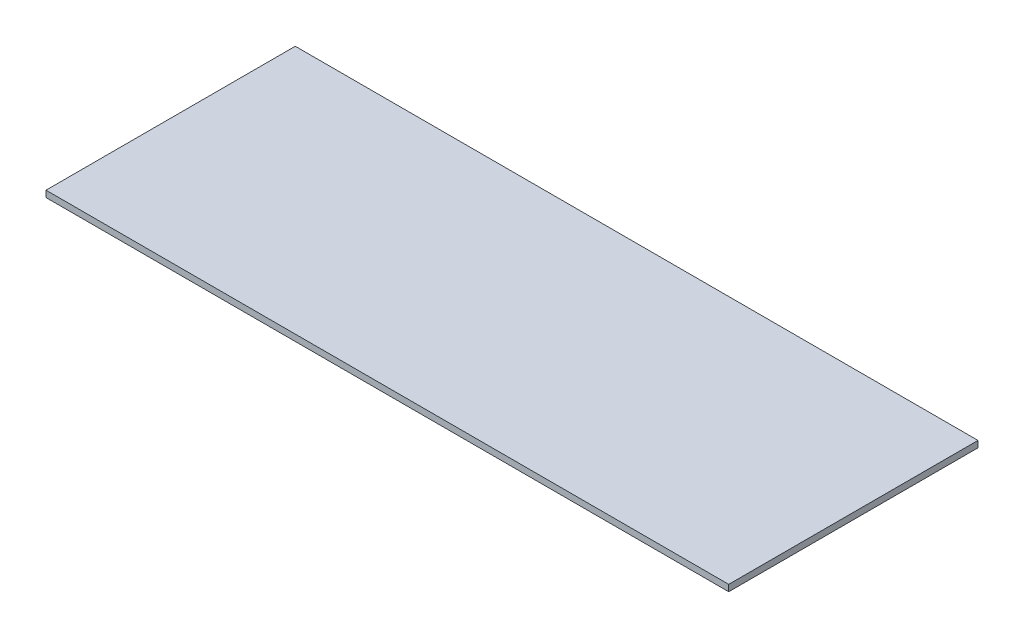
ISO-10303-21;
HEADER;
FILE_DESCRIPTION(('STEP AP214'),'2;1');
FILE_NAME('part.step','',(''),(''),'','','');
FILE_SCHEMA(('AUTOMOTIVE_DESIGN { 1 0 10303 214 1 1 1 1 }'));
ENDSEC;
DATA;
#1=APPLICATION_CONTEXT('core data for automotive mechanical design processes');
#2=APPLICATION_PROTOCOL_DEFINITION('international standard','automotive_design',2000,#1);
#3=PRODUCT_CONTEXT('',#1,'mechanical');
#4=PRODUCT('Part','Part','',(#3));
#5=PRODUCT_RELATED_PRODUCT_CATEGORY('part','',(#4));
#6=PRODUCT_DEFINITION_FORMATION('','',#4);
#7=PRODUCT_DEFINITION_CONTEXT('part definition',#1,'design');
#8=PRODUCT_DEFINITION('design','',#6,#7);
#9=PRODUCT_DEFINITION_SHAPE('','',#8);
#10=(LENGTH_UNIT() NAMED_UNIT(*) SI_UNIT(.MILLI.,.METRE.));
#11=(NAMED_UNIT(*) PLANE_ANGLE_UNIT() SI_UNIT($,.RADIAN.));
#12=(NAMED_UNIT(*) SI_UNIT($,.STERADIAN.) SOLID_ANGLE_UNIT());
#13=UNCERTAINTY_MEASURE_WITH_UNIT(LENGTH_MEASURE(1.E-05),#10,'distance_accuracy_value','');
#14=(GEOMETRIC_REPRESENTATION_CONTEXT(3) GLOBAL_UNCERTAINTY_ASSIGNED_CONTEXT((#13)) GLOBAL_UNIT_ASSIGNED_CONTEXT((#10,
#11,#12)) REPRESENTATION_CONTEXT('',''));
#15=CARTESIAN_POINT('',(0.,0.,0.));
#16=DIRECTION('',(0.,0.,1.));
#17=DIRECTION('',(1.,0.,0.));
#18=AXIS2_PLACEMENT_3D('',#15,#16,#17);
#19=CARTESIAN_POINT('',(-59.1289481870499,4.7625,-156.391847579448));
#20=DIRECTION('',(1.,0.,0.));
#21=DIRECTION('',(0.,0.,-1.));
#22=AXIS2_PLACEMENT_3D('',#19,#20,#21);
#23=PLANE('',#22);
#24=DIRECTION('',(0.,0.,1.));
#25=VECTOR('',#24,1.);
#26=CARTESIAN_POINT('',(-59.1289481870499,0.,-156.391847579448));
#27=LINE('',#26,#25);
#28=CARTESIAN_POINT('',(-59.1289481870499,0.,-156.391847579448));
#29=VERTEX_POINT('',#28);
#30=CARTESIAN_POINT('',(-59.1289481870498,0.,28.4005184205515));
#31=VERTEX_POINT('',#30);
#32=EDGE_CURVE('E98',#29,#31,#27,.T.);
#33=ORIENTED_EDGE('',*,*,#32,.T.);
#34=DIRECTION('',(0.,-1.,0.));
#35=VECTOR('',#34,1.);
#36=CARTESIAN_POINT('',(-59.1289481870498,4.7625,28.4005184205515));
#37=LINE('',#36,#35);
#38=CARTESIAN_POINT('',(-59.1289481870498,4.7625,28.4005184205515));
#39=VERTEX_POINT('',#38);
#40=EDGE_CURVE('E11',#39,#31,#37,.T.);
#41=ORIENTED_EDGE('',*,*,#40,.F.);
#42=DIRECTION('',(0.,0.,1.));
#43=VECTOR('',#42,1.);
#44=CARTESIAN_POINT('',(-59.1289481870499,4.7625,-156.391847579448));
#45=LINE('',#44,#43);
#46=CARTESIAN_POINT('',(-59.1289481870499,4.7625,-156.391847579448));
#47=VERTEX_POINT('',#46);
#48=EDGE_CURVE('E86',#47,#39,#45,.T.);
#49=ORIENTED_EDGE('',*,*,#48,.F.);
#50=DIRECTION('',(0.,-1.,0.));
#51=VECTOR('',#50,1.);
#52=CARTESIAN_POINT('',(-59.1289481870499,4.7625,-156.391847579448));
#53=LINE('',#52,#51);
#54=EDGE_CURVE('E94',#47,#29,#53,.T.);
#55=ORIENTED_EDGE('',*,*,#54,.T.);
#56=EDGE_LOOP('',(#33,#41,#49,#55));
#57=FACE_BOUND('',#56,.T.);
#58=ADVANCED_FACE('F35',(#57),#23,.F.);
#59=CARTESIAN_POINT('',(-59.1289481870498,4.7625,28.4005184205515));
#60=DIRECTION('',(0.,0.,-1.));
#61=DIRECTION('',(-1.,0.,0.));
#62=AXIS2_PLACEMENT_3D('',#59,#60,#61);
#63=PLANE('',#62);
#64=DIRECTION('',(1.,0.,0.));
#65=VECTOR('',#64,1.);
#66=CARTESIAN_POINT('',(-59.1289481870498,0.,28.4005184205515));
#67=LINE('',#66,#65);
#68=CARTESIAN_POINT('',(446.97105180295,0.,28.4005184205515));
#69=VERTEX_POINT('',#68);
#70=EDGE_CURVE('E90',#31,#69,#67,.T.);
#71=ORIENTED_EDGE('',*,*,#70,.T.);
#72=DIRECTION('',(0.,-1.,0.));
#73=VECTOR('',#72,1.);
#74=CARTESIAN_POINT('',(446.97105180295,4.7625,28.4005184205515));
#75=LINE('',#74,#73);
#76=CARTESIAN_POINT('',(446.97105180295,4.7625,28.4005184205515));
#77=VERTEX_POINT('',#76);
#78=EDGE_CURVE('E43',#77,#69,#75,.T.);
#79=ORIENTED_EDGE('',*,*,#78,.F.);
#80=DIRECTION('',(1.,0.,0.));
#81=VECTOR('',#80,1.);
#82=CARTESIAN_POINT('',(-59.1289481870498,4.7625,28.4005184205515));
#83=LINE('',#82,#81);
#84=EDGE_CURVE('E81',#39,#77,#83,.T.);
#85=ORIENTED_EDGE('',*,*,#84,.F.);
#86=ORIENTED_EDGE('',*,*,#40,.T.);
#87=EDGE_LOOP('',(#71,#79,#85,#86));
#88=FACE_BOUND('',#87,.T.);
#89=ADVANCED_FACE('F89',(#88),#63,.F.);
#90=CARTESIAN_POINT('',(446.97105180295,4.7625,-156.391847579448));
#91=DIRECTION('',(-1.,0.,0.));
#92=DIRECTION('',(0.,0.,1.));
#93=AXIS2_PLACEMENT_3D('',#90,#91,#92);
#94=PLANE('',#93);
#95=DIRECTION('',(0.,0.,-1.));
#96=VECTOR('',#95,1.);
#97=CARTESIAN_POINT('',(446.97105180295,0.,-156.391847579448));
#98=LINE('',#97,#96);
#99=CARTESIAN_POINT('',(446.97105180295,0.,-156.391847579448));
#100=VERTEX_POINT('',#99);
#101=EDGE_CURVE('E68',#69,#100,#98,.T.);
#102=ORIENTED_EDGE('',*,*,#101,.T.);
#103=DIRECTION('',(0.,-1.,0.));
#104=VECTOR('',#103,1.);
#105=CARTESIAN_POINT('',(446.97105180295,4.7625,-156.391847579448));
#106=LINE('',#105,#104);
#107=CARTESIAN_POINT('',(446.97105180295,4.7625,-156.391847579448));
#108=VERTEX_POINT('',#107);
#109=EDGE_CURVE('E91',#108,#100,#106,.T.);
#110=ORIENTED_EDGE('',*,*,#109,.F.);
#111=DIRECTION('',(0.,0.,-1.));
#112=VECTOR('',#111,1.);
#113=CARTESIAN_POINT('',(446.97105180295,4.7625,-156.391847579448));
#114=LINE('',#113,#112);
#115=EDGE_CURVE('E84',#77,#108,#114,.T.);
#116=ORIENTED_EDGE('',*,*,#115,.F.);
#117=ORIENTED_EDGE('',*,*,#78,.T.);
#118=EDGE_LOOP('',(#102,#110,#116,#117));
#119=FACE_BOUND('',#118,.T.);
#120=ADVANCED_FACE('F92',(#119),#94,.F.);
#121=CARTESIAN_POINT('',(-59.1289481870499,4.7625,-156.391847579448));
#122=DIRECTION('',(0.,0.,1.));
#123=DIRECTION('',(1.,0.,0.));
#124=AXIS2_PLACEMENT_3D('',#121,#122,#123);
#125=PLANE('',#124);
#126=DIRECTION('',(-1.,0.,0.));
#127=VECTOR('',#126,1.);
#128=CARTESIAN_POINT('',(-59.1289481870499,0.,-156.391847579448));
#129=LINE('',#128,#127);
#130=EDGE_CURVE('E74',#100,#29,#129,.T.);
#131=ORIENTED_EDGE('',*,*,#130,.T.);
#132=ORIENTED_EDGE('',*,*,#54,.F.);
#133=DIRECTION('',(-1.,0.,0.));
#134=VECTOR('',#133,1.);
#135=CARTESIAN_POINT('',(-59.1289481870499,4.7625,-156.391847579448));
#136=LINE('',#135,#134);
#137=EDGE_CURVE('E51',#108,#47,#136,.T.);
#138=ORIENTED_EDGE('',*,*,#137,.F.);
#139=ORIENTED_EDGE('',*,*,#109,.T.);
#140=EDGE_LOOP('',(#131,#132,#138,#139));
#141=FACE_BOUND('',#140,.T.);
#142=ADVANCED_FACE('F105',(#141),#125,.F.);
#143=CARTESIAN_POINT('',(0.,4.7625,0.));
#144=DIRECTION('',(0.,1.,0.));
#145=DIRECTION('',(0.,0.,1.));
#146=AXIS2_PLACEMENT_3D('',#143,#144,#145);
#147=PLANE('',#146);
#148=ORIENTED_EDGE('',*,*,#48,.T.);
#149=ORIENTED_EDGE('',*,*,#84,.T.);
#150=ORIENTED_EDGE('',*,*,#115,.T.);
#151=ORIENTED_EDGE('',*,*,#137,.T.);
#152=EDGE_LOOP('',(#148,#149,#150,#151));
#153=FACE_BOUND('',#152,.T.);
#154=ADVANCED_FACE('F82',(#153),#147,.T.);
#155=CARTESIAN_POINT('',(0.,0.,0.));
#156=DIRECTION('',(0.,1.,0.));
#157=DIRECTION('',(0.,0.,1.));
#158=AXIS2_PLACEMENT_3D('',#155,#156,#157);
#159=PLANE('',#158);
#160=ORIENTED_EDGE('',*,*,#32,.F.);
#161=ORIENTED_EDGE('',*,*,#130,.F.);
#162=ORIENTED_EDGE('',*,*,#101,.F.);
#163=ORIENTED_EDGE('',*,*,#70,.F.);
#164=EDGE_LOOP('',(#160,#161,#162,#163));
#165=FACE_BOUND('',#164,.T.);
#166=ADVANCED_FACE('F108',(#165),#159,.F.);
#167=CLOSED_SHELL('',(#58,#89,#120,#142,#154,#166));
#168=MANIFOLD_SOLID_BREP('B2',#167);
#169=ADVANCED_BREP_SHAPE_REPRESENTATION('',(#18,#168),#14);
#170=SHAPE_DEFINITION_REPRESENTATION(#9,#169);
ENDSEC;
END-ISO-10303-21;
